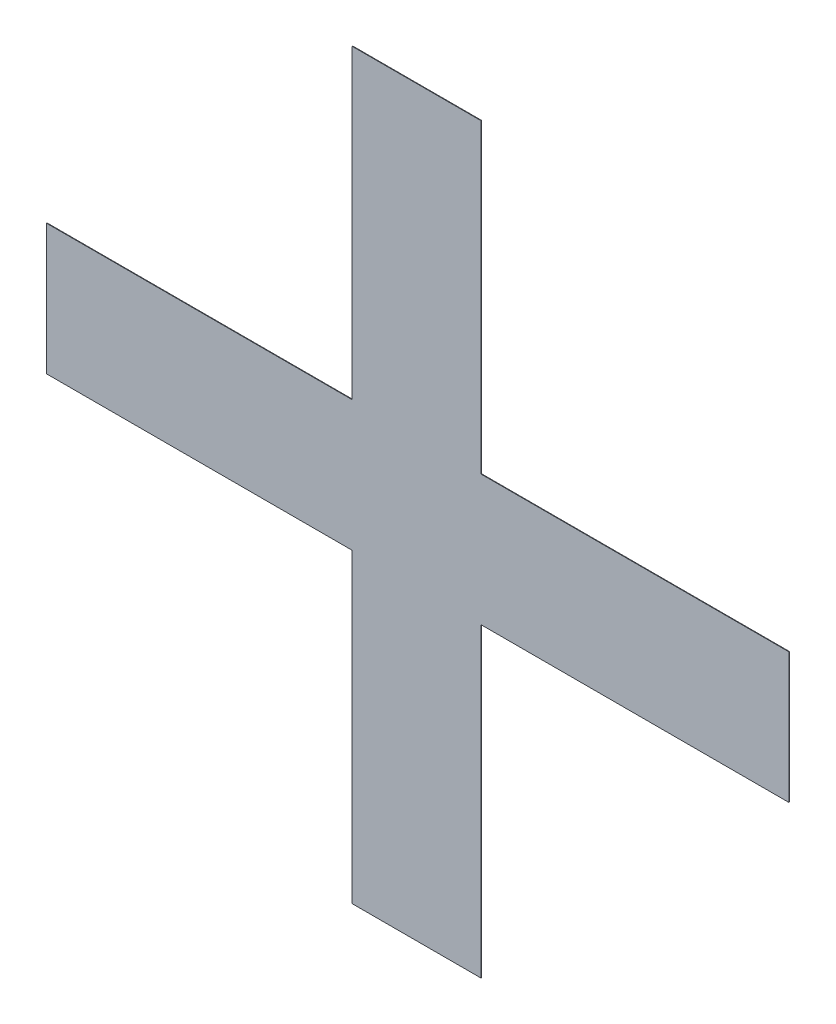
ISO-10303-21;
HEADER;
FILE_DESCRIPTION(('STEP AP214'),'2;1');
FILE_NAME('part.step','',(''),(''),'','','');
FILE_SCHEMA(('AUTOMOTIVE_DESIGN { 1 0 10303 214 1 1 1 1 }'));
ENDSEC;
DATA;
#1=APPLICATION_CONTEXT('core data for automotive mechanical design processes');
#2=APPLICATION_PROTOCOL_DEFINITION('international standard','automotive_design',2000,#1);
#3=PRODUCT_CONTEXT('',#1,'mechanical');
#4=PRODUCT('Part','Part','',(#3));
#5=PRODUCT_RELATED_PRODUCT_CATEGORY('part','',(#4));
#6=PRODUCT_DEFINITION_FORMATION('','',#4);
#7=PRODUCT_DEFINITION_CONTEXT('part definition',#1,'design');
#8=PRODUCT_DEFINITION('design','',#6,#7);
#9=PRODUCT_DEFINITION_SHAPE('','',#8);
#10=(LENGTH_UNIT() NAMED_UNIT(*) SI_UNIT(.MILLI.,.METRE.));
#11=(NAMED_UNIT(*) PLANE_ANGLE_UNIT() SI_UNIT($,.RADIAN.));
#12=(NAMED_UNIT(*) SI_UNIT($,.STERADIAN.) SOLID_ANGLE_UNIT());
#13=UNCERTAINTY_MEASURE_WITH_UNIT(LENGTH_MEASURE(1.E-05),#10,'distance_accuracy_value','');
#14=(GEOMETRIC_REPRESENTATION_CONTEXT(3) GLOBAL_UNCERTAINTY_ASSIGNED_CONTEXT((#13)) GLOBAL_UNIT_ASSIGNED_CONTEXT((#10,
#11,#12)) REPRESENTATION_CONTEXT('',''));
#15=CARTESIAN_POINT('',(0.,0.,0.));
#16=DIRECTION('',(0.,0.,1.));
#17=DIRECTION('',(1.,0.,0.));
#18=AXIS2_PLACEMENT_3D('',#15,#16,#17);
#19=CARTESIAN_POINT('',(4.25659914057703,-52.4470711743582,0.002));
#20=DIRECTION('',(0.,1.,0.));
#21=DIRECTION('',(0.,0.,1.));
#22=AXIS2_PLACEMENT_3D('',#19,#20,#21);
#23=PLANE('',#22);
#24=CARTESIAN_POINT('',(4.25659914057703,-52.4470711743582,0.));
#25=CARTESIAN_POINT('',(4.62219493895367,-52.4470711743582,0.));
#26=CARTESIAN_POINT('',(4.98779073733032,-52.4470711743582,0.));
#27=CARTESIAN_POINT('',(5.35338653570696,-52.4470711743582,0.));
#28=B_SPLINE_CURVE_WITH_KNOTS('',3,(#24,#25,#26,#27),.UNSPECIFIED.,.F.,.F.,(4,4),(0.,
0.103693190984642),.UNSPECIFIED.);
#29=CARTESIAN_POINT('',(4.25659914057703,-52.4470711743582,0.));
#30=VERTEX_POINT('',#29);
#31=CARTESIAN_POINT('',(5.35338653570696,-52.4470711743582,0.));
#32=VERTEX_POINT('',#31);
#33=EDGE_CURVE('E114',#30,#32,#28,.T.);
#34=ORIENTED_EDGE('',*,*,#33,.T.);
#35=DIRECTION('',(0.,0.,-1.));
#36=VECTOR('',#35,1.);
#37=CARTESIAN_POINT('',(5.35338653570696,-52.4470711743582,0.002));
#38=LINE('',#37,#36);
#39=CARTESIAN_POINT('',(5.35338653570696,-52.4470711743582,0.002));
#40=VERTEX_POINT('',#39);
#41=EDGE_CURVE('E123',#40,#32,#38,.T.);
#42=ORIENTED_EDGE('',*,*,#41,.F.);
#43=CARTESIAN_POINT('',(4.25659914057703,-52.4470711743582,0.002));
#44=CARTESIAN_POINT('',(4.62219493895367,-52.4470711743582,0.002));
#45=CARTESIAN_POINT('',(4.98779073733032,-52.4470711743582,0.002));
#46=CARTESIAN_POINT('',(5.35338653570696,-52.4470711743582,0.002));
#47=B_SPLINE_CURVE_WITH_KNOTS('',3,(#43,#44,#45,#46),.UNSPECIFIED.,.F.,.F.,(4,4),(0.,
0.103693190984642),.UNSPECIFIED.);
#48=CARTESIAN_POINT('',(4.25659914057703,-52.4470711743582,0.002));
#49=VERTEX_POINT('',#48);
#50=EDGE_CURVE('E128',#49,#40,#47,.T.);
#51=ORIENTED_EDGE('',*,*,#50,.F.);
#52=DIRECTION('',(0.,0.,-1.));
#53=VECTOR('',#52,1.);
#54=CARTESIAN_POINT('',(4.25659914057703,-52.4470711743582,0.002));
#55=LINE('',#54,#53);
#56=EDGE_CURVE('E120',#49,#30,#55,.T.);
#57=ORIENTED_EDGE('',*,*,#56,.T.);
#58=EDGE_LOOP('',(#34,#42,#51,#57));
#59=FACE_BOUND('',#58,.T.);
#60=ADVANCED_FACE('F17',(#59),#23,.F.);
#61=CARTESIAN_POINT('',(5.35338653570696,-52.4470711743582,0.002));
#62=DIRECTION('',(-1.,0.,0.));
#63=DIRECTION('',(0.,-1.,0.));
#64=AXIS2_PLACEMENT_3D('',#61,#62,#63);
#65=PLANE('',#64);
#66=CARTESIAN_POINT('',(5.35338653570696,-52.4470711743582,0.));
#67=CARTESIAN_POINT('',(5.35338653570696,-52.29216558637,0.));
#68=CARTESIAN_POINT('',(5.35338653570696,-52.1372599983819,0.));
#69=CARTESIAN_POINT('',(5.35338653570696,-51.9823544103937,0.));
#70=B_SPLINE_CURVE_WITH_KNOTS('',3,(#66,#67,#68,#69),.UNSPECIFIED.,.F.,.F.,(4,4),
(0.103693190984642,0.147628747112929),.UNSPECIFIED.);
#71=CARTESIAN_POINT('',(5.35338653570696,-51.9823544103937,0.));
#72=VERTEX_POINT('',#71);
#73=EDGE_CURVE('E111',#32,#72,#70,.T.);
#74=ORIENTED_EDGE('',*,*,#73,.T.);
#75=DIRECTION('',(0.,0.,-1.));
#76=VECTOR('',#75,1.);
#77=CARTESIAN_POINT('',(5.35338653570696,-51.9823544103937,0.002));
#78=LINE('',#77,#76);
#79=CARTESIAN_POINT('',(5.35338653570696,-51.9823544103937,0.002));
#80=VERTEX_POINT('',#79);
#81=EDGE_CURVE('E119',#80,#72,#78,.T.);
#82=ORIENTED_EDGE('',*,*,#81,.F.);
#83=CARTESIAN_POINT('',(5.35338653570696,-52.4470711743582,0.002));
#84=CARTESIAN_POINT('',(5.35338653570696,-52.29216558637,0.002));
#85=CARTESIAN_POINT('',(5.35338653570696,-52.1372599983819,0.002));
#86=CARTESIAN_POINT('',(5.35338653570696,-51.9823544103937,0.002));
#87=B_SPLINE_CURVE_WITH_KNOTS('',3,(#83,#84,#85,#86),.UNSPECIFIED.,.F.,.F.,(4,4),
(0.103693190984642,0.147628747112929),.UNSPECIFIED.);
#88=EDGE_CURVE('E105',#40,#80,#87,.T.);
#89=ORIENTED_EDGE('',*,*,#88,.F.);
#90=ORIENTED_EDGE('',*,*,#41,.T.);
#91=EDGE_LOOP('',(#74,#82,#89,#90));
#92=FACE_BOUND('',#91,.T.);
#93=ADVANCED_FACE('F124',(#92),#65,.F.);
#94=CARTESIAN_POINT('',(5.35338653570696,-51.9823544103937,0.002));
#95=DIRECTION('',(0.,-1.,0.));
#96=DIRECTION('',(0.,0.,-1.));
#97=AXIS2_PLACEMENT_3D('',#94,#95,#96);
#98=PLANE('',#97);
#99=CARTESIAN_POINT('',(5.35338653570696,-51.9823544103937,0.));
#100=CARTESIAN_POINT('',(4.98779073733032,-51.9823544103937,0.));
#101=CARTESIAN_POINT('',(4.62219493895367,-51.9823544103937,0.));
#102=CARTESIAN_POINT('',(4.25659914057703,-51.9823544103937,0.));
#103=B_SPLINE_CURVE_WITH_KNOTS('',3,(#99,#100,#101,#102),.UNSPECIFIED.,.F.,.F.,(4,4),
(0.147628747112929,0.251321938097571),.UNSPECIFIED.);
#104=CARTESIAN_POINT('',(4.25659914057703,-51.9823544103937,0.));
#105=VERTEX_POINT('',#104);
#106=EDGE_CURVE('E116',#72,#105,#103,.T.);
#107=ORIENTED_EDGE('',*,*,#106,.T.);
#108=DIRECTION('',(0.,0.,-1.));
#109=VECTOR('',#108,1.);
#110=CARTESIAN_POINT('',(4.25659914057703,-51.9823544103937,0.002));
#111=LINE('',#110,#109);
#112=CARTESIAN_POINT('',(4.25659914057703,-51.9823544103937,0.002));
#113=VERTEX_POINT('',#112);
#114=EDGE_CURVE('E175',#113,#105,#111,.T.);
#115=ORIENTED_EDGE('',*,*,#114,.F.);
#116=CARTESIAN_POINT('',(5.35338653570696,-51.9823544103937,0.002));
#117=CARTESIAN_POINT('',(4.98779073733032,-51.9823544103937,0.002));
#118=CARTESIAN_POINT('',(4.62219493895367,-51.9823544103937,0.002));
#119=CARTESIAN_POINT('',(4.25659914057703,-51.9823544103937,0.002));
#120=B_SPLINE_CURVE_WITH_KNOTS('',3,(#116,#117,#118,#119),.UNSPECIFIED.,.F.,.F.,(4,4),
(0.147628747112929,0.251321938097571),.UNSPECIFIED.);
#121=EDGE_CURVE('E179',#80,#113,#120,.T.);
#122=ORIENTED_EDGE('',*,*,#121,.F.);
#123=ORIENTED_EDGE('',*,*,#81,.T.);
#124=EDGE_LOOP('',(#107,#115,#122,#123));
#125=FACE_BOUND('',#124,.T.);
#126=ADVANCED_FACE('F440',(#125),#98,.F.);
#127=CARTESIAN_POINT('',(4.25659914057703,-51.9823544103937,0.002));
#128=DIRECTION('',(-1.,0.,0.));
#129=DIRECTION('',(0.,-1.,0.));
#130=AXIS2_PLACEMENT_3D('',#127,#128,#129);
#131=PLANE('',#130);
#132=CARTESIAN_POINT('',(4.25659914057703,-51.9823544103937,0.));
#133=CARTESIAN_POINT('',(4.25659914057703,-51.6189956237549,0.));
#134=CARTESIAN_POINT('',(4.25659914057703,-51.255636837116,0.));
#135=CARTESIAN_POINT('',(4.25659914057703,-50.8922780504771,0.));
#136=B_SPLINE_CURVE_WITH_KNOTS('',3,(#132,#133,#134,#135),.UNSPECIFIED.,.F.,.F.,(4,4),
(0.251321938097571,0.35438065000343),.UNSPECIFIED.);
#137=CARTESIAN_POINT('',(4.25659914057703,-50.8922780504771,0.));
#138=VERTEX_POINT('',#137);
#139=EDGE_CURVE('E189',#105,#138,#136,.T.);
#140=ORIENTED_EDGE('',*,*,#139,.T.);
#141=DIRECTION('',(0.,0.,-1.));
#142=VECTOR('',#141,1.);
#143=CARTESIAN_POINT('',(4.25659914057703,-50.8922780504771,0.002));
#144=LINE('',#143,#142);
#145=CARTESIAN_POINT('',(4.25659914057703,-50.8922780504771,0.002));
#146=VERTEX_POINT('',#145);
#147=EDGE_CURVE('E199',#146,#138,#144,.T.);
#148=ORIENTED_EDGE('',*,*,#147,.F.);
#149=CARTESIAN_POINT('',(4.25659914057703,-51.9823544103937,0.002));
#150=CARTESIAN_POINT('',(4.25659914057703,-51.6189956237549,0.002));
#151=CARTESIAN_POINT('',(4.25659914057703,-51.255636837116,0.002));
#152=CARTESIAN_POINT('',(4.25659914057703,-50.8922780504771,0.002));
#153=B_SPLINE_CURVE_WITH_KNOTS('',3,(#149,#150,#151,#152),.UNSPECIFIED.,.F.,.F.,(4,4),
(0.251321938097571,0.35438065000343),.UNSPECIFIED.);
#154=EDGE_CURVE('E203',#113,#146,#153,.T.);
#155=ORIENTED_EDGE('',*,*,#154,.F.);
#156=ORIENTED_EDGE('',*,*,#114,.T.);
#157=EDGE_LOOP('',(#140,#148,#155,#156));
#158=FACE_BOUND('',#157,.T.);
#159=ADVANCED_FACE('F436',(#158),#131,.F.);
#160=CARTESIAN_POINT('',(4.25659914057703,-50.8922780504771,0.002));
#161=DIRECTION('',(0.,-1.,0.));
#162=DIRECTION('',(0.,0.,-1.));
#163=AXIS2_PLACEMENT_3D('',#160,#161,#162);
#164=PLANE('',#163);
#165=CARTESIAN_POINT('',(4.25659914057703,-50.8922780504771,0.));
#166=CARTESIAN_POINT('',(4.10381283677783,-50.8922780504771,0.));
#167=CARTESIAN_POINT('',(3.95102653297864,-50.8922780504771,0.));
#168=CARTESIAN_POINT('',(3.79824022917944,-50.8922780504771,0.));
#169=B_SPLINE_CURVE_WITH_KNOTS('',3,(#165,#166,#167,#168),.UNSPECIFIED.,.F.,.F.,(4,4),
(0.35438065000343,0.397715117877609),.UNSPECIFIED.);
#170=CARTESIAN_POINT('',(3.79824022917944,-50.8922780504771,0.));
#171=VERTEX_POINT('',#170);
#172=EDGE_CURVE('E213',#138,#171,#169,.T.);
#173=ORIENTED_EDGE('',*,*,#172,.T.);
#174=DIRECTION('',(0.,0.,-1.));
#175=VECTOR('',#174,1.);
#176=CARTESIAN_POINT('',(3.79824022917944,-50.8922780504771,0.002));
#177=LINE('',#176,#175);
#178=CARTESIAN_POINT('',(3.79824022917944,-50.8922780504771,0.002));
#179=VERTEX_POINT('',#178);
#180=EDGE_CURVE('E223',#179,#171,#177,.T.);
#181=ORIENTED_EDGE('',*,*,#180,.F.);
#182=CARTESIAN_POINT('',(4.25659914057703,-50.8922780504771,0.002));
#183=CARTESIAN_POINT('',(4.10381283677783,-50.8922780504771,0.002));
#184=CARTESIAN_POINT('',(3.95102653297864,-50.8922780504771,0.002));
#185=CARTESIAN_POINT('',(3.79824022917944,-50.8922780504771,0.002));
#186=B_SPLINE_CURVE_WITH_KNOTS('',3,(#182,#183,#184,#185),.UNSPECIFIED.,.F.,.F.,(4,4),
(0.35438065000343,0.397715117877609),.UNSPECIFIED.);
#187=EDGE_CURVE('E227',#146,#179,#186,.T.);
#188=ORIENTED_EDGE('',*,*,#187,.F.);
#189=ORIENTED_EDGE('',*,*,#147,.T.);
#190=EDGE_LOOP('',(#173,#181,#188,#189));
#191=FACE_BOUND('',#190,.T.);
#192=ADVANCED_FACE('F431',(#191),#164,.F.);
#193=CARTESIAN_POINT('',(3.79824022917944,-50.8922780504771,0.002));
#194=DIRECTION('',(1.,0.,0.));
#195=DIRECTION('',(0.,1.,0.));
#196=AXIS2_PLACEMENT_3D('',#193,#194,#195);
#197=PLANE('',#196);
#198=CARTESIAN_POINT('',(3.79824022917944,-50.8922780504771,0.));
#199=CARTESIAN_POINT('',(3.79824022917944,-51.255636837116,0.));
#200=CARTESIAN_POINT('',(3.79824022917944,-51.6189956237549,0.));
#201=CARTESIAN_POINT('',(3.79824022917944,-51.9823544103937,0.));
#202=B_SPLINE_CURVE_WITH_KNOTS('',3,(#198,#199,#200,#201),.UNSPECIFIED.,.F.,.F.,(4,4),
(0.397715117877609,0.500773829783468),.UNSPECIFIED.);
#203=CARTESIAN_POINT('',(3.79824022917944,-51.9823544103937,0.));
#204=VERTEX_POINT('',#203);
#205=EDGE_CURVE('E237',#171,#204,#202,.T.);
#206=ORIENTED_EDGE('',*,*,#205,.T.);
#207=DIRECTION('',(0.,0.,-1.));
#208=VECTOR('',#207,1.);
#209=CARTESIAN_POINT('',(3.79824022917944,-51.9823544103937,0.002));
#210=LINE('',#209,#208);
#211=CARTESIAN_POINT('',(3.79824022917944,-51.9823544103937,0.002));
#212=VERTEX_POINT('',#211);
#213=EDGE_CURVE('E247',#212,#204,#210,.T.);
#214=ORIENTED_EDGE('',*,*,#213,.F.);
#215=CARTESIAN_POINT('',(3.79824022917944,-50.8922780504771,0.002));
#216=CARTESIAN_POINT('',(3.79824022917944,-51.255636837116,0.002));
#217=CARTESIAN_POINT('',(3.79824022917944,-51.6189956237549,0.002));
#218=CARTESIAN_POINT('',(3.79824022917944,-51.9823544103937,0.002));
#219=B_SPLINE_CURVE_WITH_KNOTS('',3,(#215,#216,#217,#218),.UNSPECIFIED.,.F.,.F.,(4,4),
(0.397715117877609,0.500773829783468),.UNSPECIFIED.);
#220=EDGE_CURVE('E251',#179,#212,#219,.T.);
#221=ORIENTED_EDGE('',*,*,#220,.F.);
#222=ORIENTED_EDGE('',*,*,#180,.T.);
#223=EDGE_LOOP('',(#206,#214,#221,#222));
#224=FACE_BOUND('',#223,.T.);
#225=ADVANCED_FACE('F427',(#224),#197,.F.);
#226=CARTESIAN_POINT('',(3.79824022917944,-51.9823544103937,0.002));
#227=DIRECTION('',(0.,-1.,0.));
#228=DIRECTION('',(0.,0.,-1.));
#229=AXIS2_PLACEMENT_3D('',#226,#227,#228);
#230=PLANE('',#229);
#231=CARTESIAN_POINT('',(3.79824022917944,-51.9823544103937,0.));
#232=CARTESIAN_POINT('',(3.43537275765635,-51.9823544103937,0.));
#233=CARTESIAN_POINT('',(3.07250528613326,-51.9823544103937,0.));
#234=CARTESIAN_POINT('',(2.70963781461018,-51.9823544103937,0.));
#235=B_SPLINE_CURVE_WITH_KNOTS('',3,(#231,#232,#233,#234),.UNSPECIFIED.,.F.,.F.,(4,4),
(0.500773829783468,0.603693190984642),.UNSPECIFIED.);
#236=CARTESIAN_POINT('',(2.70963781461018,-51.9823544103937,0.));
#237=VERTEX_POINT('',#236);
#238=EDGE_CURVE('E261',#204,#237,#235,.T.);
#239=ORIENTED_EDGE('',*,*,#238,.T.);
#240=DIRECTION('',(0.,0.,-1.));
#241=VECTOR('',#240,1.);
#242=CARTESIAN_POINT('',(2.70963781461018,-51.9823544103937,0.002));
#243=LINE('',#242,#241);
#244=CARTESIAN_POINT('',(2.70963781461018,-51.9823544103937,0.002));
#245=VERTEX_POINT('',#244);
#246=EDGE_CURVE('E271',#245,#237,#243,.T.);
#247=ORIENTED_EDGE('',*,*,#246,.F.);
#248=CARTESIAN_POINT('',(3.79824022917944,-51.9823544103937,0.002));
#249=CARTESIAN_POINT('',(3.43537275765635,-51.9823544103937,0.002));
#250=CARTESIAN_POINT('',(3.07250528613326,-51.9823544103937,0.002));
#251=CARTESIAN_POINT('',(2.70963781461018,-51.9823544103937,0.002));
#252=B_SPLINE_CURVE_WITH_KNOTS('',3,(#248,#249,#250,#251),.UNSPECIFIED.,.F.,.F.,(4,4),
(0.500773829783468,0.603693190984642),.UNSPECIFIED.);
#253=EDGE_CURVE('E275',#212,#245,#252,.T.);
#254=ORIENTED_EDGE('',*,*,#253,.F.);
#255=ORIENTED_EDGE('',*,*,#213,.T.);
#256=EDGE_LOOP('',(#239,#247,#254,#255));
#257=FACE_BOUND('',#256,.T.);
#258=ADVANCED_FACE('F423',(#257),#230,.F.);
#259=CARTESIAN_POINT('',(2.70963781461018,-51.9823544103937,0.002));
#260=DIRECTION('',(1.,0.,0.));
#261=DIRECTION('',(0.,0.,-1.));
#262=AXIS2_PLACEMENT_3D('',#259,#260,#261);
#263=PLANE('',#262);
#264=CARTESIAN_POINT('',(2.70963781461018,-51.9823544103937,0.));
#265=CARTESIAN_POINT('',(2.70963781461018,-52.1372599983819,0.));
#266=CARTESIAN_POINT('',(2.70963781461018,-52.29216558637,0.));
#267=CARTESIAN_POINT('',(2.70963781461018,-52.4470711743582,0.));
#268=B_SPLINE_CURVE_WITH_KNOTS('',3,(#264,#265,#266,#267),.UNSPECIFIED.,.F.,.F.,(4,4),
(0.603693190984642,0.647628747112929),.UNSPECIFIED.);
#269=CARTESIAN_POINT('',(2.70963781461018,-52.4470711743582,0.));
#270=VERTEX_POINT('',#269);
#271=EDGE_CURVE('E285',#237,#270,#268,.T.);
#272=ORIENTED_EDGE('',*,*,#271,.T.);
#273=DIRECTION('',(0.,0.,-1.));
#274=VECTOR('',#273,1.);
#275=CARTESIAN_POINT('',(2.70963781461018,-52.4470711743582,0.002));
#276=LINE('',#275,#274);
#277=CARTESIAN_POINT('',(2.70963781461018,-52.4470711743582,0.002));
#278=VERTEX_POINT('',#277);
#279=EDGE_CURVE('E295',#278,#270,#276,.T.);
#280=ORIENTED_EDGE('',*,*,#279,.F.);
#281=CARTESIAN_POINT('',(2.70963781461018,-51.9823544103937,0.002));
#282=CARTESIAN_POINT('',(2.70963781461018,-52.1372599983819,0.002));
#283=CARTESIAN_POINT('',(2.70963781461018,-52.29216558637,0.002));
#284=CARTESIAN_POINT('',(2.70963781461018,-52.4470711743582,0.002));
#285=B_SPLINE_CURVE_WITH_KNOTS('',3,(#281,#282,#283,#284),.UNSPECIFIED.,.F.,.F.,(4,4),
(0.603693190984642,0.647628747112929),.UNSPECIFIED.);
#286=EDGE_CURVE('E299',#245,#278,#285,.T.);
#287=ORIENTED_EDGE('',*,*,#286,.F.);
#288=ORIENTED_EDGE('',*,*,#246,.T.);
#289=EDGE_LOOP('',(#272,#280,#287,#288));
#290=FACE_BOUND('',#289,.T.);
#291=ADVANCED_FACE('F418',(#290),#263,.F.);
#292=CARTESIAN_POINT('',(2.70963781461018,-52.4470711743582,0.002));
#293=DIRECTION('',(0.,1.,0.));
#294=DIRECTION('',(0.,0.,1.));
#295=AXIS2_PLACEMENT_3D('',#292,#293,#294);
#296=PLANE('',#295);
#297=CARTESIAN_POINT('',(2.70963781461018,-52.4470711743582,0.));
#298=CARTESIAN_POINT('',(3.07250528613326,-52.4470711743582,0.));
#299=CARTESIAN_POINT('',(3.43537275765635,-52.4470711743582,0.));
#300=CARTESIAN_POINT('',(3.79824022917944,-52.4470711743582,0.));
#301=B_SPLINE_CURVE_WITH_KNOTS('',3,(#297,#298,#299,#300),.UNSPECIFIED.,.F.,.F.,(4,4),
(0.647628747112929,0.750548108314104),.UNSPECIFIED.);
#302=CARTESIAN_POINT('',(3.79824022917944,-52.4470711743582,0.));
#303=VERTEX_POINT('',#302);
#304=EDGE_CURVE('E309',#270,#303,#301,.T.);
#305=ORIENTED_EDGE('',*,*,#304,.T.);
#306=DIRECTION('',(0.,0.,-1.));
#307=VECTOR('',#306,1.);
#308=CARTESIAN_POINT('',(3.79824022917944,-52.4470711743582,0.002));
#309=LINE('',#308,#307);
#310=CARTESIAN_POINT('',(3.79824022917944,-52.4470711743582,0.002));
#311=VERTEX_POINT('',#310);
#312=EDGE_CURVE('E319',#311,#303,#309,.T.);
#313=ORIENTED_EDGE('',*,*,#312,.F.);
#314=CARTESIAN_POINT('',(2.70963781461018,-52.4470711743582,0.002));
#315=CARTESIAN_POINT('',(3.07250528613326,-52.4470711743582,0.002));
#316=CARTESIAN_POINT('',(3.43537275765635,-52.4470711743582,0.002));
#317=CARTESIAN_POINT('',(3.79824022917944,-52.4470711743582,0.002));
#318=B_SPLINE_CURVE_WITH_KNOTS('',3,(#314,#315,#316,#317),.UNSPECIFIED.,.F.,.F.,(4,4),
(0.647628747112929,0.750548108314104),.UNSPECIFIED.);
#319=EDGE_CURVE('E323',#278,#311,#318,.T.);
#320=ORIENTED_EDGE('',*,*,#319,.F.);
#321=ORIENTED_EDGE('',*,*,#279,.T.);
#322=EDGE_LOOP('',(#305,#313,#320,#321));
#323=FACE_BOUND('',#322,.T.);
#324=ADVANCED_FACE('F412',(#323),#296,.F.);
#325=CARTESIAN_POINT('',(3.79824022917944,-52.4470711743582,0.002));
#326=DIRECTION('',(1.,0.,0.));
#327=DIRECTION('',(0.,1.,0.));
#328=AXIS2_PLACEMENT_3D('',#325,#326,#327);
#329=PLANE('',#328);
#330=CARTESIAN_POINT('',(3.79824022917944,-52.4470711743582,0.));
#331=CARTESIAN_POINT('',(3.79824022917944,-52.810429960997,0.));
#332=CARTESIAN_POINT('',(3.79824022917944,-53.1737887476359,0.));
#333=CARTESIAN_POINT('',(3.79824022917943,-53.5371475342747,0.));
#334=B_SPLINE_CURVE_WITH_KNOTS('',3,(#330,#331,#332,#333),.UNSPECIFIED.,.F.,.F.,(4,4),
(0.750548108314104,0.853606820219963),.UNSPECIFIED.);
#335=CARTESIAN_POINT('',(3.79824022917943,-53.5371475342747,0.));
#336=VERTEX_POINT('',#335);
#337=EDGE_CURVE('E333',#303,#336,#334,.T.);
#338=ORIENTED_EDGE('',*,*,#337,.T.);
#339=DIRECTION('',(0.,0.,-1.));
#340=VECTOR('',#339,1.);
#341=CARTESIAN_POINT('',(3.79824022917943,-53.5371475342747,0.002));
#342=LINE('',#341,#340);
#343=CARTESIAN_POINT('',(3.79824022917943,-53.5371475342747,0.002));
#344=VERTEX_POINT('',#343);
#345=EDGE_CURVE('E343',#344,#336,#342,.T.);
#346=ORIENTED_EDGE('',*,*,#345,.F.);
#347=CARTESIAN_POINT('',(3.79824022917944,-52.4470711743582,0.002));
#348=CARTESIAN_POINT('',(3.79824022917944,-52.810429960997,0.002));
#349=CARTESIAN_POINT('',(3.79824022917944,-53.1737887476359,0.002));
#350=CARTESIAN_POINT('',(3.79824022917943,-53.5371475342747,0.002));
#351=B_SPLINE_CURVE_WITH_KNOTS('',3,(#347,#348,#349,#350),.UNSPECIFIED.,.F.,.F.,(4,4),
(0.750548108314104,0.853606820219963),.UNSPECIFIED.);
#352=EDGE_CURVE('E347',#311,#344,#351,.T.);
#353=ORIENTED_EDGE('',*,*,#352,.F.);
#354=ORIENTED_EDGE('',*,*,#312,.T.);
#355=EDGE_LOOP('',(#338,#346,#353,#354));
#356=FACE_BOUND('',#355,.T.);
#357=ADVANCED_FACE('F408',(#356),#329,.F.);
#358=CARTESIAN_POINT('',(3.79824022917943,-53.5371475342747,0.002));
#359=DIRECTION('',(0.,1.,0.));
#360=DIRECTION('',(0.,0.,1.));
#361=AXIS2_PLACEMENT_3D('',#358,#359,#360);
#362=PLANE('',#361);
#363=CARTESIAN_POINT('',(3.79824022917943,-53.5371475342747,0.));
#364=CARTESIAN_POINT('',(3.95102653297864,-53.5371475342747,0.));
#365=CARTESIAN_POINT('',(4.10381283677783,-53.5371475342747,0.));
#366=CARTESIAN_POINT('',(4.25659914057703,-53.5371475342747,0.));
#367=B_SPLINE_CURVE_WITH_KNOTS('',3,(#363,#364,#365,#366),.UNSPECIFIED.,.F.,.F.,(4,4),
(0.853606820219963,0.896941288094141),.UNSPECIFIED.);
#368=CARTESIAN_POINT('',(4.25659914057703,-53.5371475342747,0.));
#369=VERTEX_POINT('',#368);
#370=EDGE_CURVE('E357',#336,#369,#367,.T.);
#371=ORIENTED_EDGE('',*,*,#370,.T.);
#372=DIRECTION('',(0.,0.,-1.));
#373=VECTOR('',#372,1.);
#374=CARTESIAN_POINT('',(4.25659914057703,-53.5371475342747,0.002));
#375=LINE('',#374,#373);
#376=CARTESIAN_POINT('',(4.25659914057703,-53.5371475342747,0.002));
#377=VERTEX_POINT('',#376);
#378=EDGE_CURVE('E367',#377,#369,#375,.T.);
#379=ORIENTED_EDGE('',*,*,#378,.F.);
#380=CARTESIAN_POINT('',(3.79824022917943,-53.5371475342747,0.002));
#381=CARTESIAN_POINT('',(3.95102653297864,-53.5371475342747,0.002));
#382=CARTESIAN_POINT('',(4.10381283677783,-53.5371475342747,0.002));
#383=CARTESIAN_POINT('',(4.25659914057703,-53.5371475342747,0.002));
#384=B_SPLINE_CURVE_WITH_KNOTS('',3,(#380,#381,#382,#383),.UNSPECIFIED.,.F.,.F.,(4,4),
(0.853606820219963,0.896941288094141),.UNSPECIFIED.);
#385=EDGE_CURVE('E38',#344,#377,#384,.T.);
#386=ORIENTED_EDGE('',*,*,#385,.F.);
#387=ORIENTED_EDGE('',*,*,#345,.T.);
#388=EDGE_LOOP('',(#371,#379,#386,#387));
#389=FACE_BOUND('',#388,.T.);
#390=ADVANCED_FACE('F404',(#389),#362,.F.);
#391=CARTESIAN_POINT('',(4.25659914057703,-53.5371475342747,0.002));
#392=DIRECTION('',(-1.,0.,0.));
#393=DIRECTION('',(0.,-1.,0.));
#394=AXIS2_PLACEMENT_3D('',#391,#392,#393);
#395=PLANE('',#394);
#396=CARTESIAN_POINT('',(4.25659914057703,-53.5371475342747,0.));
#397=CARTESIAN_POINT('',(4.25659914057703,-53.1737887476359,0.));
#398=CARTESIAN_POINT('',(4.25659914057703,-52.810429960997,0.));
#399=CARTESIAN_POINT('',(4.25659914057703,-52.4470711743582,0.));
#400=B_SPLINE_CURVE_WITH_KNOTS('',3,(#396,#397,#398,#399),.UNSPECIFIED.,.F.,.F.,(4,4),
(0.896941288094141,1.),.UNSPECIFIED.);
#401=EDGE_CURVE('E30',#369,#30,#400,.T.);
#402=ORIENTED_EDGE('',*,*,#401,.T.);
#403=ORIENTED_EDGE('',*,*,#56,.F.);
#404=CARTESIAN_POINT('',(4.25659914057703,-53.5371475342747,0.002));
#405=CARTESIAN_POINT('',(4.25659914057703,-53.1737887476359,0.002));
#406=CARTESIAN_POINT('',(4.25659914057703,-52.810429960997,0.002));
#407=CARTESIAN_POINT('',(4.25659914057703,-52.4470711743582,0.002));
#408=B_SPLINE_CURVE_WITH_KNOTS('',3,(#404,#405,#406,#407),.UNSPECIFIED.,.F.,.F.,(4,4),
(0.896941288094141,1.),.UNSPECIFIED.);
#409=EDGE_CURVE('E11',#377,#49,#408,.T.);
#410=ORIENTED_EDGE('',*,*,#409,.F.);
#411=ORIENTED_EDGE('',*,*,#378,.T.);
#412=EDGE_LOOP('',(#402,#403,#410,#411));
#413=FACE_BOUND('',#412,.T.);
#414=ADVANCED_FACE('F398',(#413),#395,.F.);
#415=CARTESIAN_POINT('',(4.80499283814199,-52.4470711743582,0.002));
#416=DIRECTION('',(0.,0.,-1.));
#417=DIRECTION('',(-1.,0.,0.));
#418=AXIS2_PLACEMENT_3D('',#415,#416,#417);
#419=PLANE('',#418);
#420=ORIENTED_EDGE('',*,*,#50,.T.);
#421=ORIENTED_EDGE('',*,*,#88,.T.);
#422=ORIENTED_EDGE('',*,*,#121,.T.);
#423=ORIENTED_EDGE('',*,*,#154,.T.);
#424=ORIENTED_EDGE('',*,*,#187,.T.);
#425=ORIENTED_EDGE('',*,*,#220,.T.);
#426=ORIENTED_EDGE('',*,*,#253,.T.);
#427=ORIENTED_EDGE('',*,*,#286,.T.);
#428=ORIENTED_EDGE('',*,*,#319,.T.);
#429=ORIENTED_EDGE('',*,*,#352,.T.);
#430=ORIENTED_EDGE('',*,*,#385,.T.);
#431=ORIENTED_EDGE('',*,*,#409,.T.);
#432=EDGE_LOOP('',(#420,#421,#422,#423,#424,#425,#426,#427,#428,#429,#430,#431));
#433=FACE_BOUND('',#432,.T.);
#434=ADVANCED_FACE('F441',(#433),#419,.F.);
#435=CARTESIAN_POINT('',(4.80499283814199,-52.4470711743582,0.));
#436=DIRECTION('',(0.,0.,-1.));
#437=DIRECTION('',(-1.,0.,0.));
#438=AXIS2_PLACEMENT_3D('',#435,#436,#437);
#439=PLANE('',#438);
#440=ORIENTED_EDGE('',*,*,#33,.F.);
#441=ORIENTED_EDGE('',*,*,#401,.F.);
#442=ORIENTED_EDGE('',*,*,#370,.F.);
#443=ORIENTED_EDGE('',*,*,#337,.F.);
#444=ORIENTED_EDGE('',*,*,#304,.F.);
#445=ORIENTED_EDGE('',*,*,#271,.F.);
#446=ORIENTED_EDGE('',*,*,#238,.F.);
#447=ORIENTED_EDGE('',*,*,#205,.F.);
#448=ORIENTED_EDGE('',*,*,#172,.F.);
#449=ORIENTED_EDGE('',*,*,#139,.F.);
#450=ORIENTED_EDGE('',*,*,#106,.F.);
#451=ORIENTED_EDGE('',*,*,#73,.F.);
#452=EDGE_LOOP('',(#440,#441,#442,#443,#444,#445,#446,#447,#448,#449,#450,#451));
#453=FACE_BOUND('',#452,.T.);
#454=ADVANCED_FACE('F19',(#453),#439,.T.);
#455=CLOSED_SHELL('',(#60,#93,#126,#159,#192,#225,#258,#291,#324,#357,#390,#414,#434,#454));
#456=MANIFOLD_SOLID_BREP('B1',#455);
#457=ADVANCED_BREP_SHAPE_REPRESENTATION('',(#18,#456),#14);
#458=SHAPE_DEFINITION_REPRESENTATION(#9,#457);
ENDSEC;
END-ISO-10303-21;
